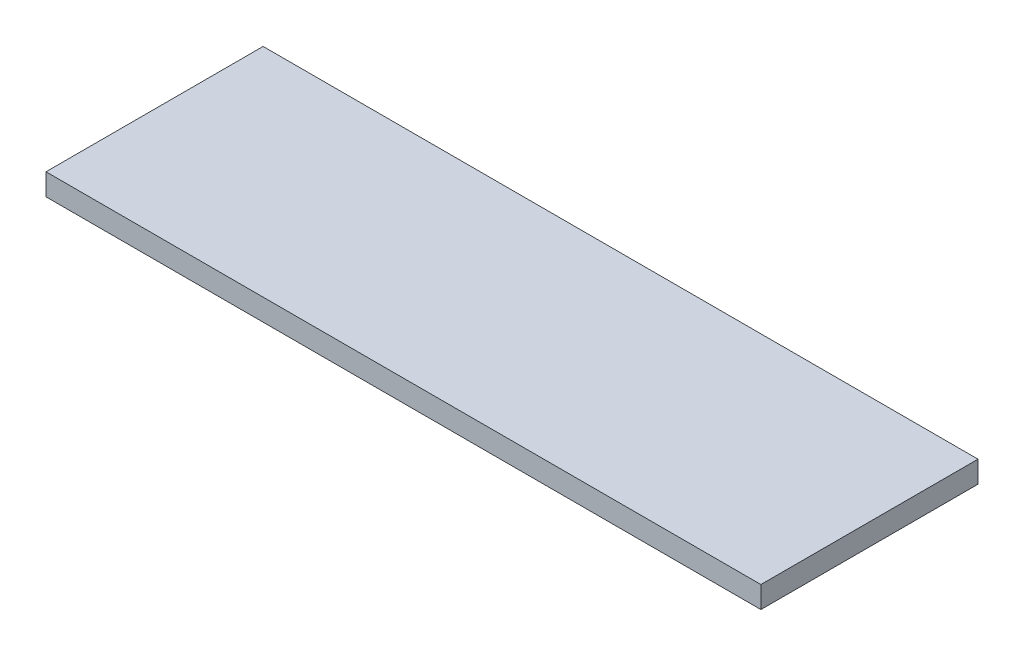
ISO-10303-21;
HEADER;
FILE_DESCRIPTION(('STEP AP214'),'2;1');
FILE_NAME('part.step','',(''),(''),'','','');
FILE_SCHEMA(('AUTOMOTIVE_DESIGN { 1 0 10303 214 1 1 1 1 }'));
ENDSEC;
DATA;
#1=APPLICATION_CONTEXT('core data for automotive mechanical design processes');
#2=APPLICATION_PROTOCOL_DEFINITION('international standard','automotive_design',2000,#1);
#3=PRODUCT_CONTEXT('',#1,'mechanical');
#4=PRODUCT('Part','Part','',(#3));
#5=PRODUCT_RELATED_PRODUCT_CATEGORY('part','',(#4));
#6=PRODUCT_DEFINITION_FORMATION('','',#4);
#7=PRODUCT_DEFINITION_CONTEXT('part definition',#1,'design');
#8=PRODUCT_DEFINITION('design','',#6,#7);
#9=PRODUCT_DEFINITION_SHAPE('','',#8);
#10=(LENGTH_UNIT() NAMED_UNIT(*) SI_UNIT(.MILLI.,.METRE.));
#11=(NAMED_UNIT(*) PLANE_ANGLE_UNIT() SI_UNIT($,.RADIAN.));
#12=(NAMED_UNIT(*) SI_UNIT($,.STERADIAN.) SOLID_ANGLE_UNIT());
#13=UNCERTAINTY_MEASURE_WITH_UNIT(LENGTH_MEASURE(1.E-05),#10,'distance_accuracy_value','');
#14=(GEOMETRIC_REPRESENTATION_CONTEXT(3) GLOBAL_UNCERTAINTY_ASSIGNED_CONTEXT((#13)) GLOBAL_UNIT_ASSIGNED_CONTEXT((#10,
#11,#12)) REPRESENTATION_CONTEXT('',''));
#15=CARTESIAN_POINT('',(0.,0.,0.));
#16=DIRECTION('',(0.,0.,1.));
#17=DIRECTION('',(1.,0.,0.));
#18=AXIS2_PLACEMENT_3D('',#15,#16,#17);
#19=CARTESIAN_POINT('',(18.9269908169872,3.,0.));
#20=DIRECTION('',(0.,0.,-1.));
#21=DIRECTION('',(0.,1.,0.));
#22=AXIS2_PLACEMENT_3D('',#19,#20,#21);
#23=PLANE('',#22);
#24=DIRECTION('',(1.,0.,0.));
#25=VECTOR('',#24,1.);
#26=CARTESIAN_POINT('',(17.9269908169872,0.,0.));
#27=LINE('',#26,#25);
#28=CARTESIAN_POINT('',(0.,0.,0.));
#29=VERTEX_POINT('',#28);
#30=CARTESIAN_POINT('',(32.9269908169872,0.,0.));
#31=VERTEX_POINT('',#30);
#32=EDGE_CURVE('E77',#29,#31,#27,.T.);
#33=ORIENTED_EDGE('',*,*,#32,.F.);
#34=DIRECTION('',(0.,1.,0.));
#35=VECTOR('',#34,1.);
#36=CARTESIAN_POINT('',(0.,0.,0.));
#37=LINE('',#36,#35);
#38=CARTESIAN_POINT('',(0.,1.,0.));
#39=VERTEX_POINT('',#38);
#40=EDGE_CURVE('E101',#29,#39,#37,.T.);
#41=ORIENTED_EDGE('',*,*,#40,.T.);
#42=DIRECTION('',(1.,0.,0.));
#43=VECTOR('',#42,1.);
#44=CARTESIAN_POINT('',(17.9269908169872,1.,0.));
#45=LINE('',#44,#43);
#46=CARTESIAN_POINT('',(32.9269908169872,1.,0.));
#47=VERTEX_POINT('',#46);
#48=EDGE_CURVE('E94',#39,#47,#45,.T.);
#49=ORIENTED_EDGE('',*,*,#48,.T.);
#50=DIRECTION('',(0.,-1.,0.));
#51=VECTOR('',#50,1.);
#52=CARTESIAN_POINT('',(32.9269908169872,1.,0.));
#53=LINE('',#52,#51);
#54=EDGE_CURVE('E113',#47,#31,#53,.T.);
#55=ORIENTED_EDGE('',*,*,#54,.T.);
#56=EDGE_LOOP('',(#33,#41,#49,#55));
#57=FACE_BOUND('',#56,.T.);
#58=ADVANCED_FACE('F44',(#57),#23,.T.);
#59=CARTESIAN_POINT('',(17.9269908169872,0.,10.));
#60=DIRECTION('',(0.,1.,0.));
#61=DIRECTION('',(0.,0.,1.));
#62=AXIS2_PLACEMENT_3D('',#59,#60,#61);
#63=PLANE('',#62);
#64=ORIENTED_EDGE('',*,*,#32,.T.);
#65=DIRECTION('',(0.,0.,-1.));
#66=VECTOR('',#65,1.);
#67=CARTESIAN_POINT('',(32.9269908169872,0.,10.));
#68=LINE('',#67,#66);
#69=CARTESIAN_POINT('',(32.9269908169872,0.,10.));
#70=VERTEX_POINT('',#69);
#71=EDGE_CURVE('E12',#70,#31,#68,.T.);
#72=ORIENTED_EDGE('',*,*,#71,.F.);
#73=DIRECTION('',(1.,0.,0.));
#74=VECTOR('',#73,1.);
#75=CARTESIAN_POINT('',(17.9269908169872,0.,10.));
#76=LINE('',#75,#74);
#77=CARTESIAN_POINT('',(0.,0.,10.));
#78=VERTEX_POINT('',#77);
#79=EDGE_CURVE('E88',#78,#70,#76,.T.);
#80=ORIENTED_EDGE('',*,*,#79,.F.);
#81=DIRECTION('',(0.,0.,-1.));
#82=VECTOR('',#81,1.);
#83=CARTESIAN_POINT('',(0.,0.,10.));
#84=LINE('',#83,#82);
#85=EDGE_CURVE('E90',#78,#29,#84,.T.);
#86=ORIENTED_EDGE('',*,*,#85,.T.);
#87=EDGE_LOOP('',(#64,#72,#80,#86));
#88=FACE_BOUND('',#87,.T.);
#89=ADVANCED_FACE('F86',(#88),#63,.F.);
#90=CARTESIAN_POINT('',(32.9269908169872,1.,10.));
#91=DIRECTION('',(1.,0.,0.));
#92=DIRECTION('',(0.,0.,1.));
#93=AXIS2_PLACEMENT_3D('',#90,#91,#92);
#94=PLANE('',#93);
#95=ORIENTED_EDGE('',*,*,#54,.F.);
#96=DIRECTION('',(0.,0.,-1.));
#97=VECTOR('',#96,1.);
#98=CARTESIAN_POINT('',(32.9269908169872,1.,10.));
#99=LINE('',#98,#97);
#100=CARTESIAN_POINT('',(32.9269908169872,1.,10.));
#101=VERTEX_POINT('',#100);
#102=EDGE_CURVE('E53',#101,#47,#99,.T.);
#103=ORIENTED_EDGE('',*,*,#102,.F.);
#104=DIRECTION('',(0.,-1.,0.));
#105=VECTOR('',#104,1.);
#106=CARTESIAN_POINT('',(32.9269908169872,1.,10.));
#107=LINE('',#106,#105);
#108=EDGE_CURVE('E91',#101,#70,#107,.T.);
#109=ORIENTED_EDGE('',*,*,#108,.T.);
#110=ORIENTED_EDGE('',*,*,#71,.T.);
#111=EDGE_LOOP('',(#95,#103,#109,#110));
#112=FACE_BOUND('',#111,.T.);
#113=ADVANCED_FACE('F119',(#112),#94,.T.);
#114=CARTESIAN_POINT('',(0.,1.,10.));
#115=DIRECTION('',(0.,1.,0.));
#116=DIRECTION('',(0.,0.,1.));
#117=AXIS2_PLACEMENT_3D('',#114,#115,#116);
#118=PLANE('',#117);
#119=ORIENTED_EDGE('',*,*,#48,.F.);
#120=DIRECTION('',(0.,0.,-1.));
#121=VECTOR('',#120,1.);
#122=CARTESIAN_POINT('',(0.,1.,10.));
#123=LINE('',#122,#121);
#124=CARTESIAN_POINT('',(0.,1.,10.));
#125=VERTEX_POINT('',#124);
#126=EDGE_CURVE('E110',#125,#39,#123,.T.);
#127=ORIENTED_EDGE('',*,*,#126,.F.);
#128=DIRECTION('',(1.,0.,0.));
#129=VECTOR('',#128,1.);
#130=CARTESIAN_POINT('',(17.9269908169872,1.,10.));
#131=LINE('',#130,#129);
#132=EDGE_CURVE('E104',#125,#101,#131,.T.);
#133=ORIENTED_EDGE('',*,*,#132,.T.);
#134=ORIENTED_EDGE('',*,*,#102,.T.);
#135=EDGE_LOOP('',(#119,#127,#133,#134));
#136=FACE_BOUND('',#135,.T.);
#137=ADVANCED_FACE('F50',(#136),#118,.T.);
#138=CARTESIAN_POINT('',(20.9269908169872,3.,10.));
#139=DIRECTION('',(0.,0.,1.));
#140=DIRECTION('',(0.,-1.,0.));
#141=AXIS2_PLACEMENT_3D('',#138,#139,#140);
#142=PLANE('',#141);
#143=ORIENTED_EDGE('',*,*,#79,.T.);
#144=ORIENTED_EDGE('',*,*,#108,.F.);
#145=ORIENTED_EDGE('',*,*,#132,.F.);
#146=DIRECTION('',(0.,1.,0.));
#147=VECTOR('',#146,1.);
#148=CARTESIAN_POINT('',(0.,0.,10.));
#149=LINE('',#148,#147);
#150=EDGE_CURVE('E99',#78,#125,#149,.T.);
#151=ORIENTED_EDGE('',*,*,#150,.F.);
#152=EDGE_LOOP('',(#143,#144,#145,#151));
#153=FACE_BOUND('',#152,.T.);
#154=ADVANCED_FACE('F103',(#153),#142,.T.);
#155=CARTESIAN_POINT('',(0.,0.,10.));
#156=DIRECTION('',(-1.,0.,0.));
#157=DIRECTION('',(0.,0.,1.));
#158=AXIS2_PLACEMENT_3D('',#155,#156,#157);
#159=PLANE('',#158);
#160=ORIENTED_EDGE('',*,*,#40,.F.);
#161=ORIENTED_EDGE('',*,*,#85,.F.);
#162=ORIENTED_EDGE('',*,*,#150,.T.);
#163=ORIENTED_EDGE('',*,*,#126,.T.);
#164=EDGE_LOOP('',(#160,#161,#162,#163));
#165=FACE_BOUND('',#164,.T.);
#166=ADVANCED_FACE('F98',(#165),#159,.T.);
#167=CLOSED_SHELL('',(#58,#89,#113,#137,#154,#166));
#168=MANIFOLD_SOLID_BREP('B2',#167);
#169=ADVANCED_BREP_SHAPE_REPRESENTATION('',(#18,#168),#14);
#170=SHAPE_DEFINITION_REPRESENTATION(#9,#169);
ENDSEC;
END-ISO-10303-21;
